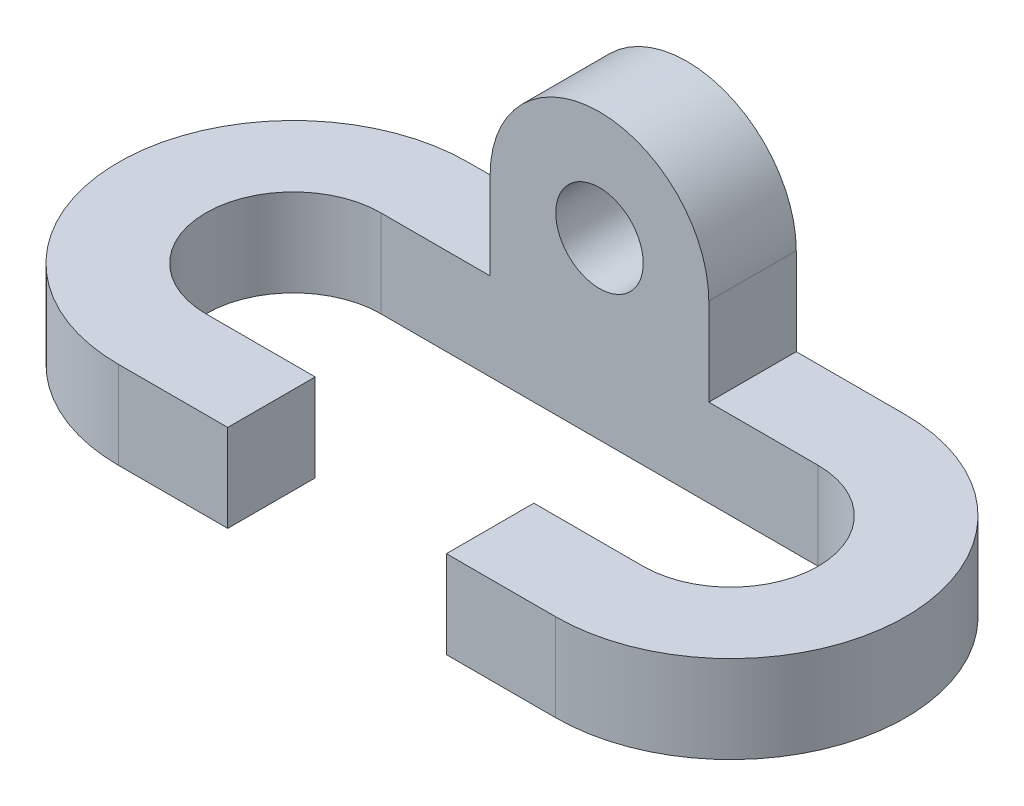
ISO-10303-21;
HEADER;
FILE_DESCRIPTION(('STEP AP214'),'2;1');
FILE_NAME('part.step','',(''),(''),'','','');
FILE_SCHEMA(('AUTOMOTIVE_DESIGN { 1 0 10303 214 1 1 1 1 }'));
ENDSEC;
DATA;
#1=APPLICATION_CONTEXT('core data for automotive mechanical design processes');
#2=APPLICATION_PROTOCOL_DEFINITION('international standard','automotive_design',2000,#1);
#3=PRODUCT_CONTEXT('',#1,'mechanical');
#4=PRODUCT('Part','Part','',(#3));
#5=PRODUCT_RELATED_PRODUCT_CATEGORY('part','',(#4));
#6=PRODUCT_DEFINITION_FORMATION('','',#4);
#7=PRODUCT_DEFINITION_CONTEXT('part definition',#1,'design');
#8=PRODUCT_DEFINITION('design','',#6,#7);
#9=PRODUCT_DEFINITION_SHAPE('','',#8);
#10=(LENGTH_UNIT() NAMED_UNIT(*) SI_UNIT(.MILLI.,.METRE.));
#11=(NAMED_UNIT(*) PLANE_ANGLE_UNIT() SI_UNIT($,.RADIAN.));
#12=(NAMED_UNIT(*) SI_UNIT($,.STERADIAN.) SOLID_ANGLE_UNIT());
#13=UNCERTAINTY_MEASURE_WITH_UNIT(LENGTH_MEASURE(1.E-05),#10,'distance_accuracy_value','');
#14=(GEOMETRIC_REPRESENTATION_CONTEXT(3) GLOBAL_UNCERTAINTY_ASSIGNED_CONTEXT((#13)) GLOBAL_UNIT_ASSIGNED_CONTEXT((#10,
#11,#12)) REPRESENTATION_CONTEXT('',''));
#15=CARTESIAN_POINT('',(0.,0.,0.));
#16=DIRECTION('',(0.,0.,1.));
#17=DIRECTION('',(1.,0.,0.));
#18=AXIS2_PLACEMENT_3D('',#15,#16,#17);
#19=CARTESIAN_POINT('',(0.,12.7,-50.8));
#20=DIRECTION('',(0.,0.,1.));
#21=DIRECTION('',(1.,0.,0.));
#22=AXIS2_PLACEMENT_3D('',#19,#20,#21);
#23=PLANE('',#22);
#24=CARTESIAN_POINT('',(-31.75,25.4,-50.8));
#25=DIRECTION('',(0.,0.,1.));
#26=DIRECTION('',(1.,0.,0.));
#27=AXIS2_PLACEMENT_3D('',#24,#25,#26);
#28=CIRCLE('',#27,6.35);
#29=CARTESIAN_POINT('',(-25.4,25.4,-50.8));
#30=VERTEX_POINT('',#29);
#31=EDGE_CURVE('E298',#30,#30,#28,.T.);
#32=ORIENTED_EDGE('',*,*,#31,.T.);
#33=EDGE_LOOP('',(#32));
#34=FACE_BOUND('',#33,.T.);
#35=CARTESIAN_POINT('',(-31.75,25.4,-50.8));
#36=DIRECTION('',(0.,0.,1.));
#37=DIRECTION('',(1.,0.,0.));
#38=AXIS2_PLACEMENT_3D('',#35,#36,#37);
#39=CIRCLE('',#38,15.875);
#40=CARTESIAN_POINT('',(-47.625,25.4,-50.8));
#41=VERTEX_POINT('',#40);
#42=CARTESIAN_POINT('',(-15.875,25.4,-50.8));
#43=VERTEX_POINT('',#42);
#44=EDGE_CURVE('E165',#41,#43,#39,.F.);
#45=ORIENTED_EDGE('',*,*,#44,.T.);
#46=DIRECTION('',(0.,-1.,0.));
#47=VECTOR('',#46,1.);
#48=CARTESIAN_POINT('',(-15.875,41.275,-50.8));
#49=LINE('',#48,#47);
#50=CARTESIAN_POINT('',(-15.875,12.7,-50.8));
#51=VERTEX_POINT('',#50);
#52=EDGE_CURVE('E168',#43,#51,#49,.T.);
#53=ORIENTED_EDGE('',*,*,#52,.T.);
#54=DIRECTION('',(-1.,0.,0.));
#55=VECTOR('',#54,1.);
#56=CARTESIAN_POINT('',(0.,12.7,-50.8));
#57=LINE('',#56,#55);
#58=CARTESIAN_POINT('',(0.,12.7,-50.8));
#59=VERTEX_POINT('',#58);
#60=EDGE_CURVE('E255',#59,#51,#57,.T.);
#61=ORIENTED_EDGE('',*,*,#60,.F.);
#62=DIRECTION('',(0.,-1.,0.));
#63=VECTOR('',#62,1.);
#64=CARTESIAN_POINT('',(0.,12.7,-50.8));
#65=LINE('',#64,#63);
#66=CARTESIAN_POINT('',(0.,0.,-50.8));
#67=VERTEX_POINT('',#66);
#68=EDGE_CURVE('E12',#59,#67,#65,.T.);
#69=ORIENTED_EDGE('',*,*,#68,.T.);
#70=DIRECTION('',(-1.,0.,0.));
#71=VECTOR('',#70,1.);
#72=CARTESIAN_POINT('',(0.,0.,-50.8));
#73=LINE('',#72,#71);
#74=CARTESIAN_POINT('',(-63.5,0.,-50.8));
#75=VERTEX_POINT('',#74);
#76=EDGE_CURVE('E266',#67,#75,#73,.T.);
#77=ORIENTED_EDGE('',*,*,#76,.T.);
#78=DIRECTION('',(0.,-1.,0.));
#79=VECTOR('',#78,1.);
#80=CARTESIAN_POINT('',(-63.5,12.7,-50.8));
#81=LINE('',#80,#79);
#82=CARTESIAN_POINT('',(-63.5,12.7,-50.8));
#83=VERTEX_POINT('',#82);
#84=EDGE_CURVE('E59',#83,#75,#81,.T.);
#85=ORIENTED_EDGE('',*,*,#84,.F.);
#86=CARTESIAN_POINT('',(-47.625,12.7,-50.8));
#87=VERTEX_POINT('',#86);
#88=EDGE_CURVE('E253',#87,#83,#57,.T.);
#89=ORIENTED_EDGE('',*,*,#88,.F.);
#90=DIRECTION('',(0.,-1.,0.));
#91=VECTOR('',#90,1.);
#92=CARTESIAN_POINT('',(-47.625,41.275,-50.8));
#93=LINE('',#92,#91);
#94=EDGE_CURVE('E66',#41,#87,#93,.T.);
#95=ORIENTED_EDGE('',*,*,#94,.F.);
#96=EDGE_LOOP('',(#45,#53,#61,#69,#77,#85,#89,#95));
#97=FACE_BOUND('',#96,.T.);
#98=ADVANCED_FACE('F51',(#34,#97),#23,.F.);
#99=CARTESIAN_POINT('',(-63.5,0.,-38.1));
#100=DIRECTION('',(0.,0.,-1.));
#101=DIRECTION('',(-1.,0.,0.));
#102=AXIS2_PLACEMENT_3D('',#99,#100,#101);
#103=PLANE('',#102);
#104=CARTESIAN_POINT('',(-31.75,25.4,-38.1));
#105=DIRECTION('',(0.,0.,1.));
#106=DIRECTION('',(1.,0.,0.));
#107=AXIS2_PLACEMENT_3D('',#104,#105,#106);
#108=CIRCLE('',#107,6.35);
#109=CARTESIAN_POINT('',(-25.4,25.4,-38.1));
#110=VERTEX_POINT('',#109);
#111=EDGE_CURVE('E301',#110,#110,#108,.T.);
#112=ORIENTED_EDGE('',*,*,#111,.F.);
#113=EDGE_LOOP('',(#112));
#114=FACE_BOUND('',#113,.T.);
#115=DIRECTION('',(0.,-1.,0.));
#116=VECTOR('',#115,1.);
#117=CARTESIAN_POINT('',(-15.875,41.275,-38.1));
#118=LINE('',#117,#116);
#119=CARTESIAN_POINT('',(-15.875,25.4,-38.1));
#120=VERTEX_POINT('',#119);
#121=CARTESIAN_POINT('',(-15.875,12.7,-38.1));
#122=VERTEX_POINT('',#121);
#123=EDGE_CURVE('E185',#120,#122,#118,.T.);
#124=ORIENTED_EDGE('',*,*,#123,.F.);
#125=CARTESIAN_POINT('',(-31.75,25.4,-38.1));
#126=DIRECTION('',(0.,0.,1.));
#127=DIRECTION('',(1.,0.,0.));
#128=AXIS2_PLACEMENT_3D('',#125,#126,#127);
#129=CIRCLE('',#128,15.875);
#130=CARTESIAN_POINT('',(-47.625,25.4,-38.1));
#131=VERTEX_POINT('',#130);
#132=EDGE_CURVE('E173',#131,#120,#129,.F.);
#133=ORIENTED_EDGE('',*,*,#132,.F.);
#134=DIRECTION('',(0.,-1.,0.));
#135=VECTOR('',#134,1.);
#136=CARTESIAN_POINT('',(-47.625,41.275,-38.1));
#137=LINE('',#136,#135);
#138=CARTESIAN_POINT('',(-47.625,12.7,-38.1));
#139=VERTEX_POINT('',#138);
#140=EDGE_CURVE('E74',#131,#139,#137,.T.);
#141=ORIENTED_EDGE('',*,*,#140,.T.);
#142=DIRECTION('',(-1.,0.,0.));
#143=VECTOR('',#142,1.);
#144=CARTESIAN_POINT('',(-63.5,12.7,-38.1));
#145=LINE('',#144,#143);
#146=CARTESIAN_POINT('',(-63.5,12.7,-38.1));
#147=VERTEX_POINT('',#146);
#148=EDGE_CURVE('E224',#139,#147,#145,.T.);
#149=ORIENTED_EDGE('',*,*,#148,.T.);
#150=DIRECTION('',(0.,1.,0.));
#151=VECTOR('',#150,1.);
#152=CARTESIAN_POINT('',(-63.5,0.,-38.1));
#153=LINE('',#152,#151);
#154=CARTESIAN_POINT('',(-63.5,0.,-38.1));
#155=VERTEX_POINT('',#154);
#156=EDGE_CURVE('E228',#155,#147,#153,.T.);
#157=ORIENTED_EDGE('',*,*,#156,.F.);
#158=DIRECTION('',(-1.,0.,0.));
#159=VECTOR('',#158,1.);
#160=CARTESIAN_POINT('',(-63.5,0.,-38.1));
#161=LINE('',#160,#159);
#162=CARTESIAN_POINT('',(0.,0.,-38.1));
#163=VERTEX_POINT('',#162);
#164=EDGE_CURVE('E216',#163,#155,#161,.T.);
#165=ORIENTED_EDGE('',*,*,#164,.F.);
#166=DIRECTION('',(0.,1.,0.));
#167=VECTOR('',#166,1.);
#168=CARTESIAN_POINT('',(0.,0.,-38.1));
#169=LINE('',#168,#167);
#170=CARTESIAN_POINT('',(0.,12.7,-38.1));
#171=VERTEX_POINT('',#170);
#172=EDGE_CURVE('E232',#163,#171,#169,.T.);
#173=ORIENTED_EDGE('',*,*,#172,.T.);
#174=EDGE_CURVE('E225',#171,#122,#145,.T.);
#175=ORIENTED_EDGE('',*,*,#174,.T.);
#176=EDGE_LOOP('',(#124,#133,#141,#149,#157,#165,#173,#175));
#177=FACE_BOUND('',#176,.T.);
#178=ADVANCED_FACE('F307',(#114,#177),#103,.F.);
#179=CARTESIAN_POINT('',(-15.875,41.275,-38.1));
#180=DIRECTION('',(-1.,0.,0.));
#181=DIRECTION('',(0.,0.,1.));
#182=AXIS2_PLACEMENT_3D('',#179,#180,#181);
#183=PLANE('',#182);
#184=DIRECTION('',(0.,0.,1.));
#185=VECTOR('',#184,1.);
#186=CARTESIAN_POINT('',(-15.875,25.4,-50.8));
#187=LINE('',#186,#185);
#188=EDGE_CURVE('E176',#43,#120,#187,.T.);
#189=ORIENTED_EDGE('',*,*,#188,.T.);
#190=ORIENTED_EDGE('',*,*,#123,.T.);
#191=DIRECTION('',(0.,0.,-1.));
#192=VECTOR('',#191,1.);
#193=CARTESIAN_POINT('',(-15.875,12.7,-38.1));
#194=LINE('',#193,#192);
#195=EDGE_CURVE('E184',#122,#51,#194,.T.);
#196=ORIENTED_EDGE('',*,*,#195,.T.);
#197=ORIENTED_EDGE('',*,*,#52,.F.);
#198=EDGE_LOOP('',(#189,#190,#196,#197));
#199=FACE_BOUND('',#198,.T.);
#200=ADVANCED_FACE('F182',(#199),#183,.F.);
#201=CARTESIAN_POINT('',(0.,12.7,-25.4));
#202=DIRECTION('',(0.,-1.,0.));
#203=DIRECTION('',(0.,0.,-1.));
#204=AXIS2_PLACEMENT_3D('',#201,#202,#203);
#205=PLANE('',#204);
#206=DIRECTION('',(0.,0.,1.));
#207=VECTOR('',#206,1.);
#208=CARTESIAN_POINT('',(-47.625,12.7,-38.1));
#209=LINE('',#208,#207);
#210=EDGE_CURVE('E296',#87,#139,#209,.T.);
#211=ORIENTED_EDGE('',*,*,#210,.F.);
#212=ORIENTED_EDGE('',*,*,#88,.T.);
#213=CARTESIAN_POINT('',(-63.5,12.7,-25.4));
#214=DIRECTION('',(0.,1.,0.));
#215=DIRECTION('',(0.,0.,1.));
#216=AXIS2_PLACEMENT_3D('',#213,#214,#215);
#217=CIRCLE('',#216,25.4);
#218=CARTESIAN_POINT('',(-63.5,12.7,0.));
#219=VERTEX_POINT('',#218);
#220=EDGE_CURVE('E257',#83,#219,#217,.T.);
#221=ORIENTED_EDGE('',*,*,#220,.T.);
#222=DIRECTION('',(1.,0.,0.));
#223=VECTOR('',#222,1.);
#224=CARTESIAN_POINT('',(0.,12.7,0.));
#225=LINE('',#224,#223);
#226=CARTESIAN_POINT('',(-47.625,12.7,0.));
#227=VERTEX_POINT('',#226);
#228=EDGE_CURVE('E260',#219,#227,#225,.T.);
#229=ORIENTED_EDGE('',*,*,#228,.T.);
#230=DIRECTION('',(0.,0.,1.));
#231=VECTOR('',#230,1.);
#232=CARTESIAN_POINT('',(-47.625,12.7,-12.7));
#233=LINE('',#232,#231);
#234=CARTESIAN_POINT('',(-47.625,12.7,-12.7));
#235=VERTEX_POINT('',#234);
#236=EDGE_CURVE('E203',#235,#227,#233,.T.);
#237=ORIENTED_EDGE('',*,*,#236,.F.);
#238=DIRECTION('',(1.,0.,0.));
#239=VECTOR('',#238,1.);
#240=CARTESIAN_POINT('',(-63.5,12.7,-12.7));
#241=LINE('',#240,#239);
#242=CARTESIAN_POINT('',(-63.5,12.7,-12.7));
#243=VERTEX_POINT('',#242);
#244=EDGE_CURVE('E221',#243,#235,#241,.T.);
#245=ORIENTED_EDGE('',*,*,#244,.F.);
#246=CARTESIAN_POINT('',(-63.5,12.7,-25.4));
#247=DIRECTION('',(0.,1.,0.));
#248=DIRECTION('',(0.,0.,1.));
#249=AXIS2_PLACEMENT_3D('',#246,#247,#248);
#250=CIRCLE('',#249,12.7);
#251=EDGE_CURVE('E231',#147,#243,#250,.T.);
#252=ORIENTED_EDGE('',*,*,#251,.F.);
#253=ORIENTED_EDGE('',*,*,#148,.F.);
#254=EDGE_LOOP('',(#211,#212,#221,#229,#237,#245,#252,#253));
#255=FACE_BOUND('',#254,.T.);
#256=ADVANCED_FACE('F294',(#255),#205,.F.);
#257=ORIENTED_EDGE('',*,*,#195,.F.);
#258=ORIENTED_EDGE('',*,*,#174,.F.);
#259=CARTESIAN_POINT('',(0.,12.7,-25.4));
#260=DIRECTION('',(0.,1.,0.));
#261=DIRECTION('',(0.,0.,1.));
#262=AXIS2_PLACEMENT_3D('',#259,#260,#261);
#263=CIRCLE('',#262,12.7);
#264=CARTESIAN_POINT('',(0.,12.7,-12.7));
#265=VERTEX_POINT('',#264);
#266=EDGE_CURVE('E243',#265,#171,#263,.T.);
#267=ORIENTED_EDGE('',*,*,#266,.F.);
#268=CARTESIAN_POINT('',(-15.875,12.7,-12.7));
#269=VERTEX_POINT('',#268);
#270=EDGE_CURVE('E205',#269,#265,#241,.T.);
#271=ORIENTED_EDGE('',*,*,#270,.F.);
#272=DIRECTION('',(0.,0.,1.));
#273=VECTOR('',#272,1.);
#274=CARTESIAN_POINT('',(-15.875,12.7,-12.7));
#275=LINE('',#274,#273);
#276=CARTESIAN_POINT('',(-15.875,12.7,0.));
#277=VERTEX_POINT('',#276);
#278=EDGE_CURVE('E206',#269,#277,#275,.T.);
#279=ORIENTED_EDGE('',*,*,#278,.T.);
#280=CARTESIAN_POINT('',(0.,12.7,0.));
#281=VERTEX_POINT('',#280);
#282=EDGE_CURVE('E259',#277,#281,#225,.T.);
#283=ORIENTED_EDGE('',*,*,#282,.T.);
#284=CARTESIAN_POINT('',(0.,12.7,-25.4));
#285=DIRECTION('',(0.,1.,0.));
#286=DIRECTION('',(0.,0.,-1.));
#287=AXIS2_PLACEMENT_3D('',#284,#285,#286);
#288=CIRCLE('',#287,25.4);
#289=EDGE_CURVE('E250',#281,#59,#288,.T.);
#290=ORIENTED_EDGE('',*,*,#289,.T.);
#291=ORIENTED_EDGE('',*,*,#60,.T.);
#292=EDGE_LOOP('',(#257,#258,#267,#271,#279,#283,#290,#291));
#293=FACE_BOUND('',#292,.T.);
#294=ADVANCED_FACE('F343',(#293),#205,.F.);
#295=CARTESIAN_POINT('',(0.,12.7,0.));
#296=DIRECTION('',(0.,0.,-1.));
#297=DIRECTION('',(-1.,0.,0.));
#298=AXIS2_PLACEMENT_3D('',#295,#296,#297);
#299=PLANE('',#298);
#300=DIRECTION('',(1.,0.,0.));
#301=VECTOR('',#300,1.);
#302=CARTESIAN_POINT('',(0.,0.,0.));
#303=LINE('',#302,#301);
#304=CARTESIAN_POINT('',(-63.5,0.,0.));
#305=VERTEX_POINT('',#304);
#306=CARTESIAN_POINT('',(-47.625,0.,0.));
#307=VERTEX_POINT('',#306);
#308=EDGE_CURVE('E254',#305,#307,#303,.T.);
#309=ORIENTED_EDGE('',*,*,#308,.T.);
#310=DIRECTION('',(0.,-1.,0.));
#311=VECTOR('',#310,1.);
#312=CARTESIAN_POINT('',(-47.625,12.7,0.));
#313=LINE('',#312,#311);
#314=EDGE_CURVE('E192',#227,#307,#313,.T.);
#315=ORIENTED_EDGE('',*,*,#314,.F.);
#316=ORIENTED_EDGE('',*,*,#228,.F.);
#317=DIRECTION('',(0.,-1.,0.));
#318=VECTOR('',#317,1.);
#319=CARTESIAN_POINT('',(-63.5,12.7,0.));
#320=LINE('',#319,#318);
#321=EDGE_CURVE('E275',#219,#305,#320,.T.);
#322=ORIENTED_EDGE('',*,*,#321,.T.);
#323=EDGE_LOOP('',(#309,#315,#316,#322));
#324=FACE_BOUND('',#323,.T.);
#325=ADVANCED_FACE('F290',(#324),#299,.F.);
#326=CARTESIAN_POINT('',(-63.5,0.,-12.7));
#327=DIRECTION('',(0.,0.,1.));
#328=DIRECTION('',(1.,0.,0.));
#329=AXIS2_PLACEMENT_3D('',#326,#327,#328);
#330=PLANE('',#329);
#331=ORIENTED_EDGE('',*,*,#244,.T.);
#332=DIRECTION('',(0.,-1.,0.));
#333=VECTOR('',#332,1.);
#334=CARTESIAN_POINT('',(-47.625,12.7,-12.7));
#335=LINE('',#334,#333);
#336=CARTESIAN_POINT('',(-47.625,0.,-12.7));
#337=VERTEX_POINT('',#336);
#338=EDGE_CURVE('E193',#235,#337,#335,.T.);
#339=ORIENTED_EDGE('',*,*,#338,.T.);
#340=DIRECTION('',(1.,0.,0.));
#341=VECTOR('',#340,1.);
#342=CARTESIAN_POINT('',(-63.5,0.,-12.7));
#343=LINE('',#342,#341);
#344=CARTESIAN_POINT('',(-63.5,0.,-12.7));
#345=VERTEX_POINT('',#344);
#346=EDGE_CURVE('E213',#345,#337,#343,.T.);
#347=ORIENTED_EDGE('',*,*,#346,.F.);
#348=DIRECTION('',(0.,1.,0.));
#349=VECTOR('',#348,1.);
#350=CARTESIAN_POINT('',(-63.5,0.,-12.7));
#351=LINE('',#350,#349);
#352=EDGE_CURVE('E220',#345,#243,#351,.T.);
#353=ORIENTED_EDGE('',*,*,#352,.T.);
#354=EDGE_LOOP('',(#331,#339,#347,#353));
#355=FACE_BOUND('',#354,.T.);
#356=ADVANCED_FACE('F351',(#355),#330,.F.);
#357=CARTESIAN_POINT('',(-63.5,12.7,-25.4));
#358=DIRECTION('',(0.,1.,0.));
#359=DIRECTION('',(0.,0.,1.));
#360=AXIS2_PLACEMENT_3D('',#357,#358,#359);
#361=CYLINDRICAL_SURFACE('',#360,12.7);
#362=ORIENTED_EDGE('',*,*,#156,.T.);
#363=ORIENTED_EDGE('',*,*,#251,.T.);
#364=ORIENTED_EDGE('',*,*,#352,.F.);
#365=CARTESIAN_POINT('',(-63.5,0.,-25.4));
#366=DIRECTION('',(0.,1.,0.));
#367=DIRECTION('',(0.,0.,1.));
#368=AXIS2_PLACEMENT_3D('',#365,#366,#367);
#369=CIRCLE('',#368,12.7);
#370=EDGE_CURVE('E240',#155,#345,#369,.T.);
#371=ORIENTED_EDGE('',*,*,#370,.F.);
#372=EDGE_LOOP('',(#362,#363,#364,#371));
#373=FACE_BOUND('',#372,.T.);
#374=ADVANCED_FACE('F348',(#373),#361,.F.);
#375=CARTESIAN_POINT('',(0.,12.7,-25.4));
#376=DIRECTION('',(0.,-1.,0.));
#377=DIRECTION('',(0.,0.,-1.));
#378=AXIS2_PLACEMENT_3D('',#375,#376,#377);
#379=CYLINDRICAL_SURFACE('',#378,25.4);
#380=CARTESIAN_POINT('',(0.,0.,-25.4));
#381=DIRECTION('',(0.,1.,0.));
#382=DIRECTION('',(0.,0.,-1.));
#383=AXIS2_PLACEMENT_3D('',#380,#381,#382);
#384=CIRCLE('',#383,25.4);
#385=CARTESIAN_POINT('',(0.,0.,0.));
#386=VERTEX_POINT('',#385);
#387=EDGE_CURVE('E249',#386,#67,#384,.T.);
#388=ORIENTED_EDGE('',*,*,#387,.T.);
#389=ORIENTED_EDGE('',*,*,#68,.F.);
#390=ORIENTED_EDGE('',*,*,#289,.F.);
#391=DIRECTION('',(0.,-1.,0.));
#392=VECTOR('',#391,1.);
#393=CARTESIAN_POINT('',(0.,12.7,0.));
#394=LINE('',#393,#392);
#395=EDGE_CURVE('E263',#281,#386,#394,.T.);
#396=ORIENTED_EDGE('',*,*,#395,.T.);
#397=EDGE_LOOP('',(#388,#389,#390,#396));
#398=FACE_BOUND('',#397,.T.);
#399=ADVANCED_FACE('F53',(#398),#379,.T.);
#400=CARTESIAN_POINT('',(-63.5,12.7,-25.4));
#401=DIRECTION('',(0.,-1.,0.));
#402=DIRECTION('',(0.,0.,-1.));
#403=AXIS2_PLACEMENT_3D('',#400,#401,#402);
#404=CYLINDRICAL_SURFACE('',#403,25.4);
#405=CARTESIAN_POINT('',(-63.5,0.,-25.4));
#406=DIRECTION('',(0.,1.,0.));
#407=DIRECTION('',(0.,0.,1.));
#408=AXIS2_PLACEMENT_3D('',#405,#406,#407);
#409=CIRCLE('',#408,25.4);
#410=EDGE_CURVE('E268',#75,#305,#409,.T.);
#411=ORIENTED_EDGE('',*,*,#410,.T.);
#412=ORIENTED_EDGE('',*,*,#321,.F.);
#413=ORIENTED_EDGE('',*,*,#220,.F.);
#414=ORIENTED_EDGE('',*,*,#84,.T.);
#415=EDGE_LOOP('',(#411,#412,#413,#414));
#416=FACE_BOUND('',#415,.T.);
#417=ADVANCED_FACE('F282',(#416),#404,.T.);
#418=ORIENTED_EDGE('',*,*,#282,.F.);
#419=DIRECTION('',(0.,1.,0.));
#420=VECTOR('',#419,1.);
#421=CARTESIAN_POINT('',(-15.875,12.7,0.));
#422=LINE('',#421,#420);
#423=CARTESIAN_POINT('',(-15.875,0.,0.));
#424=VERTEX_POINT('',#423);
#425=EDGE_CURVE('E197',#424,#277,#422,.T.);
#426=ORIENTED_EDGE('',*,*,#425,.F.);
#427=EDGE_CURVE('E270',#424,#386,#303,.T.);
#428=ORIENTED_EDGE('',*,*,#427,.T.);
#429=ORIENTED_EDGE('',*,*,#395,.F.);
#430=EDGE_LOOP('',(#418,#426,#428,#429));
#431=FACE_BOUND('',#430,.T.);
#432=ADVANCED_FACE('F334',(#431),#299,.F.);
#433=CARTESIAN_POINT('',(0.,0.,-25.4));
#434=DIRECTION('',(0.,-1.,0.));
#435=DIRECTION('',(0.,0.,-1.));
#436=AXIS2_PLACEMENT_3D('',#433,#434,#435);
#437=PLANE('',#436);
#438=DIRECTION('',(0.,0.,1.));
#439=VECTOR('',#438,1.);
#440=CARTESIAN_POINT('',(-47.625,0.,-12.7));
#441=LINE('',#440,#439);
#442=EDGE_CURVE('E200',#337,#307,#441,.T.);
#443=ORIENTED_EDGE('',*,*,#442,.T.);
#444=ORIENTED_EDGE('',*,*,#308,.F.);
#445=ORIENTED_EDGE('',*,*,#410,.F.);
#446=ORIENTED_EDGE('',*,*,#76,.F.);
#447=ORIENTED_EDGE('',*,*,#387,.F.);
#448=ORIENTED_EDGE('',*,*,#427,.F.);
#449=DIRECTION('',(0.,0.,1.));
#450=VECTOR('',#449,1.);
#451=CARTESIAN_POINT('',(-15.875,0.,-12.7));
#452=LINE('',#451,#450);
#453=CARTESIAN_POINT('',(-15.875,0.,-12.7));
#454=VERTEX_POINT('',#453);
#455=EDGE_CURVE('E209',#454,#424,#452,.T.);
#456=ORIENTED_EDGE('',*,*,#455,.F.);
#457=CARTESIAN_POINT('',(0.,0.,-12.7));
#458=VERTEX_POINT('',#457);
#459=EDGE_CURVE('E217',#454,#458,#343,.T.);
#460=ORIENTED_EDGE('',*,*,#459,.T.);
#461=CARTESIAN_POINT('',(0.,0.,-25.4));
#462=DIRECTION('',(0.,1.,0.));
#463=DIRECTION('',(0.,0.,1.));
#464=AXIS2_PLACEMENT_3D('',#461,#462,#463);
#465=CIRCLE('',#464,12.7);
#466=EDGE_CURVE('E246',#458,#163,#465,.T.);
#467=ORIENTED_EDGE('',*,*,#466,.T.);
#468=ORIENTED_EDGE('',*,*,#164,.T.);
#469=ORIENTED_EDGE('',*,*,#370,.T.);
#470=ORIENTED_EDGE('',*,*,#346,.T.);
#471=EDGE_LOOP('',(#443,#444,#445,#446,#447,#448,#456,#460,#467,#468,#469,#470));
#472=FACE_BOUND('',#471,.T.);
#473=ADVANCED_FACE('F286',(#472),#437,.T.);
#474=CARTESIAN_POINT('',(0.,12.7,-25.4));
#475=DIRECTION('',(0.,1.,0.));
#476=DIRECTION('',(0.,0.,1.));
#477=AXIS2_PLACEMENT_3D('',#474,#475,#476);
#478=CYLINDRICAL_SURFACE('',#477,12.7);
#479=ORIENTED_EDGE('',*,*,#266,.T.);
#480=ORIENTED_EDGE('',*,*,#172,.F.);
#481=ORIENTED_EDGE('',*,*,#466,.F.);
#482=DIRECTION('',(0.,1.,0.));
#483=VECTOR('',#482,1.);
#484=CARTESIAN_POINT('',(0.,0.,-12.7));
#485=LINE('',#484,#483);
#486=EDGE_CURVE('E234',#458,#265,#485,.T.);
#487=ORIENTED_EDGE('',*,*,#486,.T.);
#488=EDGE_LOOP('',(#479,#480,#481,#487));
#489=FACE_BOUND('',#488,.T.);
#490=ADVANCED_FACE('F340',(#489),#478,.F.);
#491=ORIENTED_EDGE('',*,*,#459,.F.);
#492=DIRECTION('',(0.,1.,0.));
#493=VECTOR('',#492,1.);
#494=CARTESIAN_POINT('',(-15.875,12.7,-12.7));
#495=LINE('',#494,#493);
#496=EDGE_CURVE('E196',#454,#269,#495,.T.);
#497=ORIENTED_EDGE('',*,*,#496,.T.);
#498=ORIENTED_EDGE('',*,*,#270,.T.);
#499=ORIENTED_EDGE('',*,*,#486,.F.);
#500=EDGE_LOOP('',(#491,#497,#498,#499));
#501=FACE_BOUND('',#500,.T.);
#502=ADVANCED_FACE('F346',(#501),#330,.F.);
#503=CARTESIAN_POINT('',(-15.875,12.7,-12.7));
#504=DIRECTION('',(1.,0.,0.));
#505=DIRECTION('',(0.,0.,-1.));
#506=AXIS2_PLACEMENT_3D('',#503,#504,#505);
#507=PLANE('',#506);
#508=ORIENTED_EDGE('',*,*,#425,.T.);
#509=ORIENTED_EDGE('',*,*,#278,.F.);
#510=ORIENTED_EDGE('',*,*,#496,.F.);
#511=ORIENTED_EDGE('',*,*,#455,.T.);
#512=EDGE_LOOP('',(#508,#509,#510,#511));
#513=FACE_BOUND('',#512,.T.);
#514=ADVANCED_FACE('F319',(#513),#507,.F.);
#515=CARTESIAN_POINT('',(-47.625,12.7,-12.7));
#516=DIRECTION('',(-1.,0.,0.));
#517=DIRECTION('',(0.,0.,1.));
#518=AXIS2_PLACEMENT_3D('',#515,#516,#517);
#519=PLANE('',#518);
#520=ORIENTED_EDGE('',*,*,#314,.T.);
#521=ORIENTED_EDGE('',*,*,#442,.F.);
#522=ORIENTED_EDGE('',*,*,#338,.F.);
#523=ORIENTED_EDGE('',*,*,#236,.T.);
#524=EDGE_LOOP('',(#520,#521,#522,#523));
#525=FACE_BOUND('',#524,.T.);
#526=ADVANCED_FACE('F311',(#525),#519,.F.);
#527=CARTESIAN_POINT('',(-47.625,41.275,-38.1));
#528=DIRECTION('',(1.,0.,0.));
#529=DIRECTION('',(0.,0.,-1.));
#530=AXIS2_PLACEMENT_3D('',#527,#528,#529);
#531=PLANE('',#530);
#532=ORIENTED_EDGE('',*,*,#140,.F.);
#533=DIRECTION('',(0.,0.,1.));
#534=VECTOR('',#533,1.);
#535=CARTESIAN_POINT('',(-47.625,25.4,-50.8));
#536=LINE('',#535,#534);
#537=EDGE_CURVE('E172',#41,#131,#536,.T.);
#538=ORIENTED_EDGE('',*,*,#537,.F.);
#539=ORIENTED_EDGE('',*,*,#94,.T.);
#540=ORIENTED_EDGE('',*,*,#210,.T.);
#541=EDGE_LOOP('',(#532,#538,#539,#540));
#542=FACE_BOUND('',#541,.T.);
#543=ADVANCED_FACE('F308',(#542),#531,.F.);
#544=CARTESIAN_POINT('',(-31.75,25.4,-38.1));
#545=DIRECTION('',(0.,0.,1.));
#546=DIRECTION('',(1.,0.,0.));
#547=AXIS2_PLACEMENT_3D('',#544,#545,#546);
#548=CYLINDRICAL_SURFACE('',#547,6.35);
#549=ORIENTED_EDGE('',*,*,#31,.F.);
#550=EDGE_LOOP('',(#549));
#551=FACE_BOUND('',#550,.T.);
#552=ORIENTED_EDGE('',*,*,#111,.T.);
#553=EDGE_LOOP('',(#552));
#554=FACE_BOUND('',#553,.T.);
#555=ADVANCED_FACE('F310',(#551,#554),#548,.F.);
#556=CARTESIAN_POINT('',(-31.75,25.4,-50.8));
#557=DIRECTION('',(0.,0.,1.));
#558=DIRECTION('',(1.,0.,0.));
#559=AXIS2_PLACEMENT_3D('',#556,#557,#558);
#560=CYLINDRICAL_SURFACE('',#559,15.875);
#561=ORIENTED_EDGE('',*,*,#132,.T.);
#562=ORIENTED_EDGE('',*,*,#188,.F.);
#563=ORIENTED_EDGE('',*,*,#44,.F.);
#564=ORIENTED_EDGE('',*,*,#537,.T.);
#565=EDGE_LOOP('',(#561,#562,#563,#564));
#566=FACE_BOUND('',#565,.T.);
#567=ADVANCED_FACE('F177',(#566),#560,.T.);
#568=CLOSED_SHELL('',(#98,#178,#200,#256,#294,#325,#356,#374,#399,#417,#432,#473,#490,#502,#514,
#526,#543,#555,#567));
#569=MANIFOLD_SOLID_BREP('B2',#568);
#570=ADVANCED_BREP_SHAPE_REPRESENTATION('',(#18,#569),#14);
#571=SHAPE_DEFINITION_REPRESENTATION(#9,#570);
ENDSEC;
END-ISO-10303-21;
